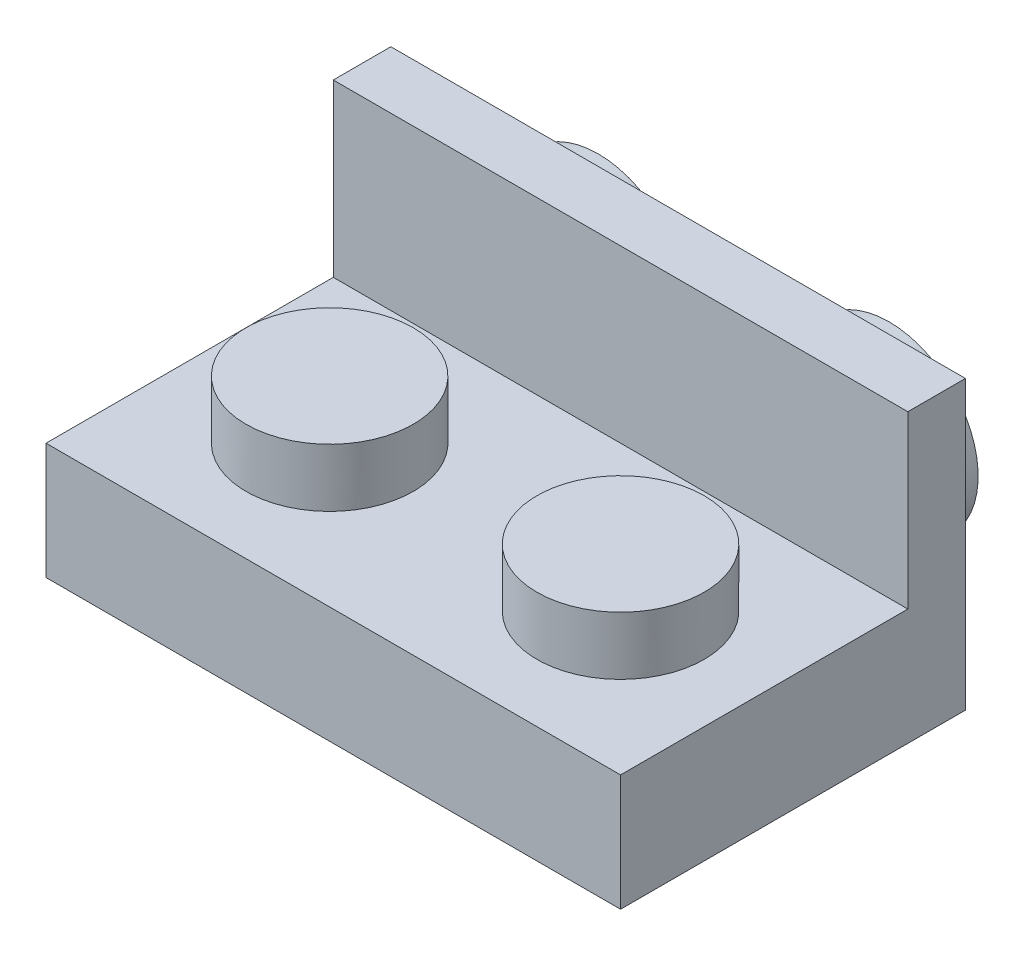
ISO-10303-21;
HEADER;
FILE_DESCRIPTION(('STEP AP214'),'2;1');
FILE_NAME('part.step','',(''),(''),'','','');
FILE_SCHEMA(('AUTOMOTIVE_DESIGN { 1 0 10303 214 1 1 1 1 }'));
ENDSEC;
DATA;
#1=APPLICATION_CONTEXT('core data for automotive mechanical design processes');
#2=APPLICATION_PROTOCOL_DEFINITION('international standard','automotive_design',2000,#1);
#3=PRODUCT_CONTEXT('',#1,'mechanical');
#4=PRODUCT('Part','Part','',(#3));
#5=PRODUCT_RELATED_PRODUCT_CATEGORY('part','',(#4));
#6=PRODUCT_DEFINITION_FORMATION('','',#4);
#7=PRODUCT_DEFINITION_CONTEXT('part definition',#1,'design');
#8=PRODUCT_DEFINITION('design','',#6,#7);
#9=PRODUCT_DEFINITION_SHAPE('','',#8);
#10=(LENGTH_UNIT() NAMED_UNIT(*) SI_UNIT(.MILLI.,.METRE.));
#11=(NAMED_UNIT(*) PLANE_ANGLE_UNIT() SI_UNIT($,.RADIAN.));
#12=(NAMED_UNIT(*) SI_UNIT($,.STERADIAN.) SOLID_ANGLE_UNIT());
#13=UNCERTAINTY_MEASURE_WITH_UNIT(LENGTH_MEASURE(1.E-05),#10,'distance_accuracy_value','');
#14=(GEOMETRIC_REPRESENTATION_CONTEXT(3) GLOBAL_UNCERTAINTY_ASSIGNED_CONTEXT((#13)) GLOBAL_UNIT_ASSIGNED_CONTEXT((#10,
#11,#12)) REPRESENTATION_CONTEXT('',''));
#15=CARTESIAN_POINT('',(0.,0.,0.));
#16=DIRECTION('',(0.,0.,1.));
#17=DIRECTION('',(1.,0.,0.));
#18=AXIS2_PLACEMENT_3D('',#15,#16,#17);
#19=CARTESIAN_POINT('',(0.681967213114738,2.,7.9));
#20=DIRECTION('',(0.,-1.,0.));
#21=DIRECTION('',(0.,0.,-1.));
#22=AXIS2_PLACEMENT_3D('',#19,#20,#21);
#23=PLANE('',#22);
#24=CARTESIAN_POINT('',(8.58196721311474,2.,4.));
#25=DIRECTION('',(0.,-1.,0.));
#26=DIRECTION('',(0.,0.,-1.));
#27=AXIS2_PLACEMENT_3D('',#24,#25,#26);
#28=CIRCLE('',#27,1.75);
#29=CARTESIAN_POINT('',(8.58196721311474,2.,2.25));
#30=VERTEX_POINT('',#29);
#31=EDGE_CURVE('E326',#30,#30,#28,.F.);
#32=ORIENTED_EDGE('',*,*,#31,.T.);
#33=EDGE_LOOP('',(#32));
#34=FACE_BOUND('',#33,.T.);
#35=CARTESIAN_POINT('',(12.5819672131147,2.,4.));
#36=DIRECTION('',(0.,-1.,0.));
#37=DIRECTION('',(0.,0.,-1.));
#38=AXIS2_PLACEMENT_3D('',#35,#36,#37);
#39=CIRCLE('',#38,1.1);
#40=CARTESIAN_POINT('',(12.5819672131147,2.,2.9));
#41=VERTEX_POINT('',#40);
#42=EDGE_CURVE('E335',#41,#41,#39,.F.);
#43=ORIENTED_EDGE('',*,*,#42,.T.);
#44=EDGE_LOOP('',(#43));
#45=FACE_BOUND('',#44,.T.);
#46=CARTESIAN_POINT('',(4.58196721311474,2.,4.));
#47=DIRECTION('',(0.,-1.,0.));
#48=DIRECTION('',(0.,0.,-1.));
#49=AXIS2_PLACEMENT_3D('',#46,#47,#48);
#50=CIRCLE('',#49,1.1);
#51=CARTESIAN_POINT('',(4.58196721311474,2.,2.9));
#52=VERTEX_POINT('',#51);
#53=EDGE_CURVE('E338',#52,#52,#50,.F.);
#54=ORIENTED_EDGE('',*,*,#53,.T.);
#55=EDGE_LOOP('',(#54));
#56=FACE_BOUND('',#55,.T.);
#57=DIRECTION('',(1.,0.,0.));
#58=VECTOR('',#57,1.);
#59=CARTESIAN_POINT('',(0.681967213114738,2.,1.11625417247108));
#60=LINE('',#59,#58);
#61=CARTESIAN_POINT('',(12.083755575767,2.,1.11625417247108));
#62=VERTEX_POINT('',#61);
#63=CARTESIAN_POINT('',(13.0805836740926,2.,1.11625417247108));
#64=VERTEX_POINT('',#63);
#65=EDGE_CURVE('E57',#62,#64,#60,.T.);
#66=ORIENTED_EDGE('',*,*,#65,.T.);
#67=DIRECTION('',(0.,0.,-1.));
#68=VECTOR('',#67,1.);
#69=CARTESIAN_POINT('',(13.0805836740926,2.,7.9));
#70=LINE('',#69,#68);
#71=CARTESIAN_POINT('',(13.0805836740926,2.,-0.383745827528921));
#72=VERTEX_POINT('',#71);
#73=EDGE_CURVE('E280',#64,#72,#70,.T.);
#74=ORIENTED_EDGE('',*,*,#73,.T.);
#75=DIRECTION('',(1.,0.,0.));
#76=VECTOR('',#75,1.);
#77=CARTESIAN_POINT('',(0.,2.,-0.383745827528922));
#78=LINE('',#77,#76);
#79=CARTESIAN_POINT('',(15.2819672131147,2.,-0.38374582752892));
#80=VERTEX_POINT('',#79);
#81=EDGE_CURVE('E197',#72,#80,#78,.T.);
#82=ORIENTED_EDGE('',*,*,#81,.T.);
#83=DIRECTION('',(0.,0.,-1.));
#84=VECTOR('',#83,1.);
#85=CARTESIAN_POINT('',(15.2819672131147,2.,7.9));
#86=LINE('',#85,#84);
#87=CARTESIAN_POINT('',(15.2819672131147,2.,6.7));
#88=VERTEX_POINT('',#87);
#89=EDGE_CURVE('E344',#88,#80,#86,.T.);
#90=ORIENTED_EDGE('',*,*,#89,.F.);
#91=DIRECTION('',(-1.,0.,0.));
#92=VECTOR('',#91,1.);
#93=CARTESIAN_POINT('',(0.,2.,6.7));
#94=LINE('',#93,#92);
#95=CARTESIAN_POINT('',(1.88196721311474,2.,6.7));
#96=VERTEX_POINT('',#95);
#97=EDGE_CURVE('E345',#88,#96,#94,.T.);
#98=ORIENTED_EDGE('',*,*,#97,.T.);
#99=DIRECTION('',(0.,0.,-1.));
#100=VECTOR('',#99,1.);
#101=CARTESIAN_POINT('',(1.88196721311474,2.,7.9));
#102=LINE('',#101,#100);
#103=CARTESIAN_POINT('',(1.88196721311474,2.,-0.383745827528922));
#104=VERTEX_POINT('',#103);
#105=EDGE_CURVE('E342',#96,#104,#102,.T.);
#106=ORIENTED_EDGE('',*,*,#105,.T.);
#107=CARTESIAN_POINT('',(4.08335075213692,2.,-0.383745827528922));
#108=VERTEX_POINT('',#107);
#109=EDGE_CURVE('E283',#104,#108,#78,.T.);
#110=ORIENTED_EDGE('',*,*,#109,.T.);
#111=DIRECTION('',(0.,0.,1.));
#112=VECTOR('',#111,1.);
#113=CARTESIAN_POINT('',(4.08335075213692,2.,7.9));
#114=LINE('',#113,#112);
#115=CARTESIAN_POINT('',(4.08335075213692,2.,1.11625417247108));
#116=VERTEX_POINT('',#115);
#117=EDGE_CURVE('E270',#108,#116,#114,.T.);
#118=ORIENTED_EDGE('',*,*,#117,.T.);
#119=DIRECTION('',(1.,0.,0.));
#120=VECTOR('',#119,1.);
#121=CARTESIAN_POINT('',(0.681967213114738,2.,1.11625417247108));
#122=LINE('',#121,#120);
#123=CARTESIAN_POINT('',(5.08017885046247,2.,1.11625417247108));
#124=VERTEX_POINT('',#123);
#125=EDGE_CURVE('E393',#116,#124,#122,.T.);
#126=ORIENTED_EDGE('',*,*,#125,.T.);
#127=DIRECTION('',(0.,0.,-1.));
#128=VECTOR('',#127,1.);
#129=CARTESIAN_POINT('',(5.08017885046247,2.,7.9));
#130=LINE('',#129,#128);
#131=CARTESIAN_POINT('',(5.08017885046247,2.,-0.383745827528922));
#132=VERTEX_POINT('',#131);
#133=EDGE_CURVE('E199',#124,#132,#130,.T.);
#134=ORIENTED_EDGE('',*,*,#133,.T.);
#135=CARTESIAN_POINT('',(8.07925649111435,2.,-0.383745827528921));
#136=VERTEX_POINT('',#135);
#137=EDGE_CURVE('E287',#132,#136,#78,.T.);
#138=ORIENTED_EDGE('',*,*,#137,.T.);
#139=DIRECTION('',(0.,0.,1.));
#140=VECTOR('',#139,1.);
#141=CARTESIAN_POINT('',(8.07925649111435,2.,7.9));
#142=LINE('',#141,#140);
#143=CARTESIAN_POINT('',(8.07925649111435,2.,1.11625417247108));
#144=VERTEX_POINT('',#143);
#145=EDGE_CURVE('E276',#136,#144,#142,.T.);
#146=ORIENTED_EDGE('',*,*,#145,.T.);
#147=DIRECTION('',(1.,0.,0.));
#148=VECTOR('',#147,1.);
#149=CARTESIAN_POINT('',(0.681967213114737,2.,1.11625417247108));
#150=LINE('',#149,#148);
#151=CARTESIAN_POINT('',(9.07608458943991,2.,1.11625417247108));
#152=VERTEX_POINT('',#151);
#153=EDGE_CURVE('E398',#144,#152,#150,.T.);
#154=ORIENTED_EDGE('',*,*,#153,.T.);
#155=DIRECTION('',(0.,0.,-1.));
#156=VECTOR('',#155,1.);
#157=CARTESIAN_POINT('',(9.07608458943991,2.,7.9));
#158=LINE('',#157,#156);
#159=CARTESIAN_POINT('',(9.07608458943991,2.,-0.383745827528922));
#160=VERTEX_POINT('',#159);
#161=EDGE_CURVE('E273',#152,#160,#158,.T.);
#162=ORIENTED_EDGE('',*,*,#161,.T.);
#163=CARTESIAN_POINT('',(12.083755575767,2.,-0.383745827528921));
#164=VERTEX_POINT('',#163);
#165=EDGE_CURVE('E547',#160,#164,#78,.T.);
#166=ORIENTED_EDGE('',*,*,#165,.T.);
#167=DIRECTION('',(0.,0.,1.));
#168=VECTOR('',#167,1.);
#169=CARTESIAN_POINT('',(12.083755575767,2.,7.90000000000001));
#170=LINE('',#169,#168);
#171=EDGE_CURVE('E62',#164,#62,#170,.T.);
#172=ORIENTED_EDGE('',*,*,#171,.T.);
#173=EDGE_LOOP('',(#66,#74,#82,#90,#98,#106,#110,#118,#126,#134,#138,#146,#154,#162,#166,#172));
#174=FACE_BOUND('',#173,.T.);
#175=ADVANCED_FACE('F41',(#34,#45,#56,#174),#23,.T.);
#176=CARTESIAN_POINT('',(0.,15.4931550495251,-0.383745827528922));
#177=DIRECTION('',(0.,0.,1.));
#178=DIRECTION('',(1.,0.,0.));
#179=AXIS2_PLACEMENT_3D('',#176,#177,#178);
#180=PLANE('',#179);
#181=ORIENTED_EDGE('',*,*,#81,.F.);
#182=DIRECTION('',(0.,1.,0.));
#183=VECTOR('',#182,1.);
#184=CARTESIAN_POINT('',(13.0805836740926,0.0500000000000006,-0.383745827528916));
#185=LINE('',#184,#183);
#186=CARTESIAN_POINT('',(13.0805836740926,0.0500000000000006,-0.383745827528916));
#187=VERTEX_POINT('',#186);
#188=EDGE_CURVE('E190',#187,#72,#185,.T.);
#189=ORIENTED_EDGE('',*,*,#188,.F.);
#190=DIRECTION('',(1.,0.,0.));
#191=VECTOR('',#190,1.);
#192=CARTESIAN_POINT('',(13.0805836740926,0.0500000000000006,-0.383745827528916));
#193=LINE('',#192,#191);
#194=CARTESIAN_POINT('',(12.083755575767,0.0499999999999997,-0.383745827528921));
#195=VERTEX_POINT('',#194);
#196=EDGE_CURVE('E194',#195,#187,#193,.T.);
#197=ORIENTED_EDGE('',*,*,#196,.F.);
#198=DIRECTION('',(0.,1.,0.));
#199=VECTOR('',#198,1.);
#200=CARTESIAN_POINT('',(12.083755575767,0.0500000000000006,-0.383745827528916));
#201=LINE('',#200,#199);
#202=EDGE_CURVE('E225',#195,#164,#201,.T.);
#203=ORIENTED_EDGE('',*,*,#202,.T.);
#204=ORIENTED_EDGE('',*,*,#165,.F.);
#205=DIRECTION('',(0.,1.,0.));
#206=VECTOR('',#205,1.);
#207=CARTESIAN_POINT('',(9.07608458943991,0.0500000000000006,-0.383745827528922));
#208=LINE('',#207,#206);
#209=CARTESIAN_POINT('',(9.07608458943991,0.0500000000000006,-0.383745827528922));
#210=VERTEX_POINT('',#209);
#211=EDGE_CURVE('E238',#210,#160,#208,.T.);
#212=ORIENTED_EDGE('',*,*,#211,.F.);
#213=DIRECTION('',(1.,0.,0.));
#214=VECTOR('',#213,1.);
#215=CARTESIAN_POINT('',(8.07925649111435,0.0500000000000006,-0.383745827528921));
#216=LINE('',#215,#214);
#217=CARTESIAN_POINT('',(8.07925649111435,0.0499999999999997,-0.383745827528921));
#218=VERTEX_POINT('',#217);
#219=EDGE_CURVE('E245',#218,#210,#216,.T.);
#220=ORIENTED_EDGE('',*,*,#219,.F.);
#221=DIRECTION('',(0.,1.,0.));
#222=VECTOR('',#221,1.);
#223=CARTESIAN_POINT('',(8.07925649111435,0.0500000000000006,-0.383745827528921));
#224=LINE('',#223,#222);
#225=EDGE_CURVE('E234',#218,#136,#224,.T.);
#226=ORIENTED_EDGE('',*,*,#225,.T.);
#227=ORIENTED_EDGE('',*,*,#137,.F.);
#228=DIRECTION('',(0.,1.,0.));
#229=VECTOR('',#228,1.);
#230=CARTESIAN_POINT('',(5.08017885046247,0.0500000000000001,-0.383745827528922));
#231=LINE('',#230,#229);
#232=CARTESIAN_POINT('',(5.08017885046247,0.0500000000000001,-0.383745827528922));
#233=VERTEX_POINT('',#232);
#234=EDGE_CURVE('E252',#233,#132,#231,.T.);
#235=ORIENTED_EDGE('',*,*,#234,.F.);
#236=DIRECTION('',(1.,0.,0.));
#237=VECTOR('',#236,1.);
#238=CARTESIAN_POINT('',(4.08335075213692,0.0500000000000001,-0.383745827528922));
#239=LINE('',#238,#237);
#240=CARTESIAN_POINT('',(4.08335075213692,0.0499999999999997,-0.383745827528922));
#241=VERTEX_POINT('',#240);
#242=EDGE_CURVE('E264',#241,#233,#239,.T.);
#243=ORIENTED_EDGE('',*,*,#242,.F.);
#244=DIRECTION('',(0.,1.,0.));
#245=VECTOR('',#244,1.);
#246=CARTESIAN_POINT('',(4.08335075213692,0.0500000000000001,-0.383745827528922));
#247=LINE('',#246,#245);
#248=EDGE_CURVE('E249',#241,#108,#247,.T.);
#249=ORIENTED_EDGE('',*,*,#248,.T.);
#250=ORIENTED_EDGE('',*,*,#109,.F.);
#251=DIRECTION('',(0.,-1.,0.));
#252=VECTOR('',#251,1.);
#253=CARTESIAN_POINT('',(1.88196721311474,15.4931550495251,-0.383745827528922));
#254=LINE('',#253,#252);
#255=CARTESIAN_POINT('',(1.88196721311474,0.,-0.383745827528922));
#256=VERTEX_POINT('',#255);
#257=EDGE_CURVE('E291',#104,#256,#254,.T.);
#258=ORIENTED_EDGE('',*,*,#257,.T.);
#259=DIRECTION('',(-1.,0.,0.));
#260=VECTOR('',#259,1.);
#261=CARTESIAN_POINT('',(0.,0.,-0.383745827528922));
#262=LINE('',#261,#260);
#263=CARTESIAN_POINT('',(15.2819672131147,0.,-0.38374582752892));
#264=VERTEX_POINT('',#263);
#265=EDGE_CURVE('E282',#264,#256,#262,.T.);
#266=ORIENTED_EDGE('',*,*,#265,.F.);
#267=DIRECTION('',(0.,-1.,0.));
#268=VECTOR('',#267,1.);
#269=CARTESIAN_POINT('',(15.2819672131147,15.4931550495251,-0.38374582752892));
#270=LINE('',#269,#268);
#271=EDGE_CURVE('E290',#80,#264,#270,.T.);
#272=ORIENTED_EDGE('',*,*,#271,.F.);
#273=EDGE_LOOP('',(#181,#189,#197,#203,#204,#212,#220,#226,#227,#235,#243,#249,#250,#258,#266,#272));
#274=FACE_BOUND('',#273,.T.);
#275=ADVANCED_FACE('F192',(#274),#180,.T.);
#276=CARTESIAN_POINT('',(0.681967213114738,0.,7.9));
#277=DIRECTION('',(0.,1.,0.));
#278=DIRECTION('',(0.,0.,1.));
#279=AXIS2_PLACEMENT_3D('',#276,#277,#278);
#280=PLANE('',#279);
#281=DIRECTION('',(0.,0.,-1.));
#282=VECTOR('',#281,1.);
#283=CARTESIAN_POINT('',(0.681967213114738,0.,7.9));
#284=LINE('',#283,#282);
#285=CARTESIAN_POINT('',(0.681967213114738,0.,7.9));
#286=VERTEX_POINT('',#285);
#287=CARTESIAN_POINT('',(0.68196721311474,0.,-1.58374582752892));
#288=VERTEX_POINT('',#287);
#289=EDGE_CURVE('E379',#286,#288,#284,.T.);
#290=ORIENTED_EDGE('',*,*,#289,.T.);
#291=DIRECTION('',(1.,0.,0.));
#292=VECTOR('',#291,1.);
#293=CARTESIAN_POINT('',(0.68196721311474,0.,-1.58374582752892));
#294=LINE('',#293,#292);
#295=CARTESIAN_POINT('',(16.4819672131147,0.,-1.58374582752892));
#296=VERTEX_POINT('',#295);
#297=EDGE_CURVE('E302',#288,#296,#294,.T.);
#298=ORIENTED_EDGE('',*,*,#297,.T.);
#299=DIRECTION('',(0.,0.,-1.));
#300=VECTOR('',#299,1.);
#301=CARTESIAN_POINT('',(16.4819672131147,0.,7.9));
#302=LINE('',#301,#300);
#303=CARTESIAN_POINT('',(16.4819672131147,0.,7.9));
#304=VERTEX_POINT('',#303);
#305=EDGE_CURVE('E377',#304,#296,#302,.T.);
#306=ORIENTED_EDGE('',*,*,#305,.F.);
#307=DIRECTION('',(1.,0.,0.));
#308=VECTOR('',#307,1.);
#309=CARTESIAN_POINT('',(0.681967213114738,0.,7.9));
#310=LINE('',#309,#308);
#311=EDGE_CURVE('E366',#286,#304,#310,.T.);
#312=ORIENTED_EDGE('',*,*,#311,.F.);
#313=EDGE_LOOP('',(#290,#298,#306,#312));
#314=FACE_BOUND('',#313,.T.);
#315=DIRECTION('',(0.,0.,-1.));
#316=VECTOR('',#315,1.);
#317=CARTESIAN_POINT('',(15.2819672131147,0.,7.9));
#318=LINE('',#317,#316);
#319=CARTESIAN_POINT('',(15.2819672131147,0.,6.7));
#320=VERTEX_POINT('',#319);
#321=EDGE_CURVE('E350',#320,#264,#318,.T.);
#322=ORIENTED_EDGE('',*,*,#321,.T.);
#323=ORIENTED_EDGE('',*,*,#265,.T.);
#324=DIRECTION('',(0.,0.,-1.));
#325=VECTOR('',#324,1.);
#326=CARTESIAN_POINT('',(1.88196721311474,0.,7.9));
#327=LINE('',#326,#325);
#328=CARTESIAN_POINT('',(1.88196721311474,0.,6.7));
#329=VERTEX_POINT('',#328);
#330=EDGE_CURVE('E341',#329,#256,#327,.T.);
#331=ORIENTED_EDGE('',*,*,#330,.F.);
#332=DIRECTION('',(1.,0.,0.));
#333=VECTOR('',#332,1.);
#334=CARTESIAN_POINT('',(0.,0.,6.7));
#335=LINE('',#334,#333);
#336=EDGE_CURVE('E353',#329,#320,#335,.T.);
#337=ORIENTED_EDGE('',*,*,#336,.T.);
#338=EDGE_LOOP('',(#322,#323,#331,#337));
#339=FACE_BOUND('',#338,.T.);
#340=ADVANCED_FACE('F449',(#314,#339),#280,.F.);
#341=CARTESIAN_POINT('',(16.4819672131147,0.,7.9));
#342=DIRECTION('',(-1.,0.,0.));
#343=DIRECTION('',(0.,0.,1.));
#344=AXIS2_PLACEMENT_3D('',#341,#342,#343);
#345=PLANE('',#344);
#346=ORIENTED_EDGE('',*,*,#305,.T.);
#347=DIRECTION('',(0.,1.,0.));
#348=VECTOR('',#347,1.);
#349=CARTESIAN_POINT('',(16.4819672131147,7.9,-1.58374582752892));
#350=LINE('',#349,#348);
#351=CARTESIAN_POINT('',(16.4819672131147,7.9,-1.58374582752892));
#352=VERTEX_POINT('',#351);
#353=EDGE_CURVE('E299',#296,#352,#350,.T.);
#354=ORIENTED_EDGE('',*,*,#353,.T.);
#355=DIRECTION('',(0.,0.,1.));
#356=VECTOR('',#355,1.);
#357=CARTESIAN_POINT('',(16.4819672131147,7.9,-1.58374582752892));
#358=LINE('',#357,#356);
#359=CARTESIAN_POINT('',(16.4819672131147,7.9,0.));
#360=VERTEX_POINT('',#359);
#361=EDGE_CURVE('E305',#352,#360,#358,.T.);
#362=ORIENTED_EDGE('',*,*,#361,.T.);
#363=DIRECTION('',(0.,-1.,0.));
#364=VECTOR('',#363,1.);
#365=CARTESIAN_POINT('',(16.4819672131147,0.,0.));
#366=LINE('',#365,#364);
#367=CARTESIAN_POINT('',(16.4819672131147,3.2,0.));
#368=VERTEX_POINT('',#367);
#369=EDGE_CURVE('E315',#360,#368,#366,.T.);
#370=ORIENTED_EDGE('',*,*,#369,.T.);
#371=DIRECTION('',(0.,0.,-1.));
#372=VECTOR('',#371,1.);
#373=CARTESIAN_POINT('',(16.4819672131147,3.2,7.9));
#374=LINE('',#373,#372);
#375=CARTESIAN_POINT('',(16.4819672131147,3.2,7.9));
#376=VERTEX_POINT('',#375);
#377=EDGE_CURVE('E375',#376,#368,#374,.T.);
#378=ORIENTED_EDGE('',*,*,#377,.F.);
#379=DIRECTION('',(0.,1.,0.));
#380=VECTOR('',#379,1.);
#381=CARTESIAN_POINT('',(16.4819672131147,0.,7.9));
#382=LINE('',#381,#380);
#383=EDGE_CURVE('E368',#304,#376,#382,.T.);
#384=ORIENTED_EDGE('',*,*,#383,.F.);
#385=EDGE_LOOP('',(#346,#354,#362,#370,#378,#384));
#386=FACE_BOUND('',#385,.T.);
#387=ADVANCED_FACE('F517',(#386),#345,.F.);
#388=CARTESIAN_POINT('',(0.681967213114738,3.2,7.9));
#389=DIRECTION('',(0.,-1.,0.));
#390=DIRECTION('',(0.,0.,-1.));
#391=AXIS2_PLACEMENT_3D('',#388,#389,#390);
#392=PLANE('',#391);
#393=CARTESIAN_POINT('',(12.5819672131147,3.2,4.));
#394=DIRECTION('',(0.,-1.,0.));
#395=DIRECTION('',(0.,0.,-1.));
#396=AXIS2_PLACEMENT_3D('',#393,#394,#395);
#397=CIRCLE('',#396,2.3);
#398=CARTESIAN_POINT('',(12.5819672131147,3.2,1.7));
#399=VERTEX_POINT('',#398);
#400=EDGE_CURVE('E384',#399,#399,#397,.F.);
#401=ORIENTED_EDGE('',*,*,#400,.F.);
#402=EDGE_LOOP('',(#401));
#403=FACE_BOUND('',#402,.T.);
#404=CARTESIAN_POINT('',(4.58196721311474,3.2,4.));
#405=DIRECTION('',(0.,-1.,0.));
#406=DIRECTION('',(0.,0.,-1.));
#407=AXIS2_PLACEMENT_3D('',#404,#405,#406);
#408=CIRCLE('',#407,2.3);
#409=CARTESIAN_POINT('',(4.58196721311474,3.2,1.7));
#410=VERTEX_POINT('',#409);
#411=EDGE_CURVE('E381',#410,#410,#408,.F.);
#412=ORIENTED_EDGE('',*,*,#411,.F.);
#413=EDGE_LOOP('',(#412));
#414=FACE_BOUND('',#413,.T.);
#415=DIRECTION('',(1.,0.,0.));
#416=VECTOR('',#415,1.);
#417=CARTESIAN_POINT('',(0.681967213114738,3.2,0.));
#418=LINE('',#417,#416);
#419=CARTESIAN_POINT('',(0.681967213114738,3.2,0.));
#420=VERTEX_POINT('',#419);
#421=EDGE_CURVE('E327',#420,#368,#418,.T.);
#422=ORIENTED_EDGE('',*,*,#421,.F.);
#423=DIRECTION('',(0.,0.,-1.));
#424=VECTOR('',#423,1.);
#425=CARTESIAN_POINT('',(0.681967213114738,3.2,7.9));
#426=LINE('',#425,#424);
#427=CARTESIAN_POINT('',(0.681967213114738,3.2,7.9));
#428=VERTEX_POINT('',#427);
#429=EDGE_CURVE('E372',#428,#420,#426,.T.);
#430=ORIENTED_EDGE('',*,*,#429,.F.);
#431=DIRECTION('',(-1.,0.,0.));
#432=VECTOR('',#431,1.);
#433=CARTESIAN_POINT('',(0.681967213114738,3.2,7.9));
#434=LINE('',#433,#432);
#435=EDGE_CURVE('E370',#376,#428,#434,.T.);
#436=ORIENTED_EDGE('',*,*,#435,.F.);
#437=ORIENTED_EDGE('',*,*,#377,.T.);
#438=EDGE_LOOP('',(#422,#430,#436,#437));
#439=FACE_BOUND('',#438,.T.);
#440=ADVANCED_FACE('F509',(#403,#414,#439),#392,.F.);
#441=CARTESIAN_POINT('',(15.2819672131147,0.,7.9));
#442=DIRECTION('',(-1.,0.,0.));
#443=DIRECTION('',(0.,0.,1.));
#444=AXIS2_PLACEMENT_3D('',#441,#442,#443);
#445=PLANE('',#444);
#446=ORIENTED_EDGE('',*,*,#89,.T.);
#447=ORIENTED_EDGE('',*,*,#271,.T.);
#448=ORIENTED_EDGE('',*,*,#321,.F.);
#449=DIRECTION('',(0.,1.,0.));
#450=VECTOR('',#449,1.);
#451=CARTESIAN_POINT('',(15.2819672131147,0.,6.7));
#452=LINE('',#451,#450);
#453=EDGE_CURVE('E347',#320,#88,#452,.T.);
#454=ORIENTED_EDGE('',*,*,#453,.T.);
#455=EDGE_LOOP('',(#446,#447,#448,#454));
#456=FACE_BOUND('',#455,.T.);
#457=ADVANCED_FACE('F507',(#456),#445,.T.);
#458=CARTESIAN_POINT('',(12.5819672131147,4.8,4.));
#459=DIRECTION('',(0.,1.,0.));
#460=DIRECTION('',(0.,0.,1.));
#461=AXIS2_PLACEMENT_3D('',#458,#459,#460);
#462=PLANE('',#461);
#463=CARTESIAN_POINT('',(12.5819672131147,4.8,4.));
#464=DIRECTION('',(0.,1.,0.));
#465=DIRECTION('',(0.,0.,1.));
#466=AXIS2_PLACEMENT_3D('',#463,#464,#465);
#467=CIRCLE('',#466,2.3);
#468=CARTESIAN_POINT('',(12.5819672131147,4.8,6.3));
#469=VERTEX_POINT('',#468);
#470=EDGE_CURVE('E387',#469,#469,#467,.T.);
#471=ORIENTED_EDGE('',*,*,#470,.T.);
#472=EDGE_LOOP('',(#471));
#473=FACE_BOUND('',#472,.T.);
#474=ADVANCED_FACE('F43',(#473),#462,.T.);
#475=CARTESIAN_POINT('',(12.5819672131147,4.8,4.));
#476=DIRECTION('',(0.,-1.,0.));
#477=DIRECTION('',(0.,0.,-1.));
#478=AXIS2_PLACEMENT_3D('',#475,#476,#477);
#479=CYLINDRICAL_SURFACE('',#478,2.3);
#480=ORIENTED_EDGE('',*,*,#470,.F.);
#481=EDGE_LOOP('',(#480));
#482=FACE_BOUND('',#481,.T.);
#483=ORIENTED_EDGE('',*,*,#400,.T.);
#484=EDGE_LOOP('',(#483));
#485=FACE_BOUND('',#484,.T.);
#486=ADVANCED_FACE('F514',(#482,#485),#479,.T.);
#487=CARTESIAN_POINT('',(0.681967213114738,0.,7.9));
#488=DIRECTION('',(1.,0.,0.));
#489=DIRECTION('',(0.,0.,-1.));
#490=AXIS2_PLACEMENT_3D('',#487,#488,#489);
#491=PLANE('',#490);
#492=ORIENTED_EDGE('',*,*,#429,.T.);
#493=DIRECTION('',(0.,-1.,0.));
#494=VECTOR('',#493,1.);
#495=CARTESIAN_POINT('',(0.68196721311474,0.,0.));
#496=LINE('',#495,#494);
#497=CARTESIAN_POINT('',(0.68196721311474,7.9,0.));
#498=VERTEX_POINT('',#497);
#499=EDGE_CURVE('E308',#498,#420,#496,.T.);
#500=ORIENTED_EDGE('',*,*,#499,.F.);
#501=DIRECTION('',(0.,0.,1.));
#502=VECTOR('',#501,1.);
#503=CARTESIAN_POINT('',(0.68196721311474,7.9,-1.58374582752892));
#504=LINE('',#503,#502);
#505=CARTESIAN_POINT('',(0.68196721311474,7.9,-1.58374582752892));
#506=VERTEX_POINT('',#505);
#507=EDGE_CURVE('E298',#506,#498,#504,.T.);
#508=ORIENTED_EDGE('',*,*,#507,.F.);
#509=DIRECTION('',(0.,1.,0.));
#510=VECTOR('',#509,1.);
#511=CARTESIAN_POINT('',(0.68196721311474,7.9,-1.58374582752892));
#512=LINE('',#511,#510);
#513=EDGE_CURVE('E286',#288,#506,#512,.T.);
#514=ORIENTED_EDGE('',*,*,#513,.F.);
#515=ORIENTED_EDGE('',*,*,#289,.F.);
#516=DIRECTION('',(0.,-1.,0.));
#517=VECTOR('',#516,1.);
#518=CARTESIAN_POINT('',(0.681967213114738,0.,7.9));
#519=LINE('',#518,#517);
#520=EDGE_CURVE('E363',#428,#286,#519,.T.);
#521=ORIENTED_EDGE('',*,*,#520,.F.);
#522=EDGE_LOOP('',(#492,#500,#508,#514,#515,#521));
#523=FACE_BOUND('',#522,.T.);
#524=ADVANCED_FACE('F641',(#523),#491,.F.);
#525=CARTESIAN_POINT('',(0.,0.,7.9));
#526=DIRECTION('',(0.,0.,-1.));
#527=DIRECTION('',(-1.,0.,0.));
#528=AXIS2_PLACEMENT_3D('',#525,#526,#527);
#529=PLANE('',#528);
#530=ORIENTED_EDGE('',*,*,#520,.T.);
#531=ORIENTED_EDGE('',*,*,#311,.T.);
#532=ORIENTED_EDGE('',*,*,#383,.T.);
#533=ORIENTED_EDGE('',*,*,#435,.T.);
#534=EDGE_LOOP('',(#530,#531,#532,#533));
#535=FACE_BOUND('',#534,.T.);
#536=ADVANCED_FACE('F644',(#535),#529,.F.);
#537=CARTESIAN_POINT('',(4.58196721311474,4.8,4.));
#538=DIRECTION('',(0.,-1.,0.));
#539=DIRECTION('',(0.,0.,-1.));
#540=AXIS2_PLACEMENT_3D('',#537,#538,#539);
#541=CYLINDRICAL_SURFACE('',#540,2.3);
#542=CARTESIAN_POINT('',(4.58196721311474,4.8,4.));
#543=DIRECTION('',(0.,1.,0.));
#544=DIRECTION('',(0.,0.,1.));
#545=AXIS2_PLACEMENT_3D('',#542,#543,#544);
#546=CIRCLE('',#545,2.3);
#547=CARTESIAN_POINT('',(4.58196721311474,4.8,6.3));
#548=VERTEX_POINT('',#547);
#549=EDGE_CURVE('E334',#548,#548,#546,.T.);
#550=ORIENTED_EDGE('',*,*,#549,.F.);
#551=EDGE_LOOP('',(#550));
#552=FACE_BOUND('',#551,.T.);
#553=ORIENTED_EDGE('',*,*,#411,.T.);
#554=EDGE_LOOP('',(#553));
#555=FACE_BOUND('',#554,.T.);
#556=ADVANCED_FACE('F665',(#552,#555),#541,.T.);
#557=CARTESIAN_POINT('',(4.58196721311474,4.8,4.));
#558=DIRECTION('',(0.,1.,0.));
#559=DIRECTION('',(0.,0.,1.));
#560=AXIS2_PLACEMENT_3D('',#557,#558,#559);
#561=PLANE('',#560);
#562=ORIENTED_EDGE('',*,*,#549,.T.);
#563=EDGE_LOOP('',(#562));
#564=FACE_BOUND('',#563,.T.);
#565=ADVANCED_FACE('F499',(#564),#561,.T.);
#566=CARTESIAN_POINT('',(12.5819672131147,3.6,4.));
#567=DIRECTION('',(0.,1.,0.));
#568=DIRECTION('',(0.,0.,1.));
#569=AXIS2_PLACEMENT_3D('',#566,#567,#568);
#570=PLANE('',#569);
#571=CARTESIAN_POINT('',(12.5819672131147,3.6,4.));
#572=DIRECTION('',(0.,1.,0.));
#573=DIRECTION('',(0.,0.,1.));
#574=AXIS2_PLACEMENT_3D('',#571,#572,#573);
#575=CIRCLE('',#574,1.1);
#576=CARTESIAN_POINT('',(12.5819672131147,3.6,5.1));
#577=VERTEX_POINT('',#576);
#578=EDGE_CURVE('E331',#577,#577,#575,.T.);
#579=ORIENTED_EDGE('',*,*,#578,.F.);
#580=EDGE_LOOP('',(#579));
#581=FACE_BOUND('',#580,.T.);
#582=ADVANCED_FACE('F495',(#581),#570,.F.);
#583=CARTESIAN_POINT('',(12.5819672131147,4.8,4.));
#584=DIRECTION('',(0.,-1.,0.));
#585=DIRECTION('',(0.,0.,-1.));
#586=AXIS2_PLACEMENT_3D('',#583,#584,#585);
#587=CYLINDRICAL_SURFACE('',#586,1.1);
#588=ORIENTED_EDGE('',*,*,#578,.T.);
#589=EDGE_LOOP('',(#588));
#590=FACE_BOUND('',#589,.T.);
#591=ORIENTED_EDGE('',*,*,#42,.F.);
#592=EDGE_LOOP('',(#591));
#593=FACE_BOUND('',#592,.T.);
#594=ADVANCED_FACE('F498',(#590,#593),#587,.F.);
#595=CARTESIAN_POINT('',(1.88196721311474,0.,7.9));
#596=DIRECTION('',(1.,0.,0.));
#597=DIRECTION('',(0.,0.,-1.));
#598=AXIS2_PLACEMENT_3D('',#595,#596,#597);
#599=PLANE('',#598);
#600=ORIENTED_EDGE('',*,*,#330,.T.);
#601=ORIENTED_EDGE('',*,*,#257,.F.);
#602=ORIENTED_EDGE('',*,*,#105,.F.);
#603=DIRECTION('',(0.,-1.,0.));
#604=VECTOR('',#603,1.);
#605=CARTESIAN_POINT('',(1.88196721311474,0.,6.7));
#606=LINE('',#605,#604);
#607=EDGE_CURVE('E351',#96,#329,#606,.T.);
#608=ORIENTED_EDGE('',*,*,#607,.T.);
#609=EDGE_LOOP('',(#600,#601,#602,#608));
#610=FACE_BOUND('',#609,.T.);
#611=ADVANCED_FACE('F503',(#610),#599,.T.);
#612=CARTESIAN_POINT('',(0.,0.,6.7));
#613=DIRECTION('',(0.,0.,-1.));
#614=DIRECTION('',(-1.,0.,0.));
#615=AXIS2_PLACEMENT_3D('',#612,#613,#614);
#616=PLANE('',#615);
#617=ORIENTED_EDGE('',*,*,#607,.F.);
#618=ORIENTED_EDGE('',*,*,#97,.F.);
#619=ORIENTED_EDGE('',*,*,#453,.F.);
#620=ORIENTED_EDGE('',*,*,#336,.F.);
#621=EDGE_LOOP('',(#617,#618,#619,#620));
#622=FACE_BOUND('',#621,.T.);
#623=ADVANCED_FACE('F505',(#622),#616,.T.);
#624=CARTESIAN_POINT('',(4.58196721311474,4.8,4.));
#625=DIRECTION('',(0.,-1.,0.));
#626=DIRECTION('',(0.,0.,-1.));
#627=AXIS2_PLACEMENT_3D('',#624,#625,#626);
#628=CYLINDRICAL_SURFACE('',#627,1.1);
#629=CARTESIAN_POINT('',(4.58196721311474,3.6,4.));
#630=DIRECTION('',(0.,1.,0.));
#631=DIRECTION('',(0.,0.,1.));
#632=AXIS2_PLACEMENT_3D('',#629,#630,#631);
#633=CIRCLE('',#632,1.1);
#634=CARTESIAN_POINT('',(4.58196721311474,3.6,5.1));
#635=VERTEX_POINT('',#634);
#636=EDGE_CURVE('E330',#635,#635,#633,.T.);
#637=ORIENTED_EDGE('',*,*,#636,.T.);
#638=EDGE_LOOP('',(#637));
#639=FACE_BOUND('',#638,.T.);
#640=ORIENTED_EDGE('',*,*,#53,.F.);
#641=EDGE_LOOP('',(#640));
#642=FACE_BOUND('',#641,.T.);
#643=ADVANCED_FACE('F679',(#639,#642),#628,.F.);
#644=CARTESIAN_POINT('',(4.58196721311474,3.6,4.));
#645=DIRECTION('',(0.,1.,0.));
#646=DIRECTION('',(0.,0.,1.));
#647=AXIS2_PLACEMENT_3D('',#644,#645,#646);
#648=PLANE('',#647);
#649=ORIENTED_EDGE('',*,*,#636,.F.);
#650=EDGE_LOOP('',(#649));
#651=FACE_BOUND('',#650,.T.);
#652=ADVANCED_FACE('F490',(#651),#648,.F.);
#653=CARTESIAN_POINT('',(8.58196721311474,0.200000000000001,4.));
#654=DIRECTION('',(0.,-1.,0.));
#655=DIRECTION('',(1.,0.,0.));
#656=AXIS2_PLACEMENT_3D('',#653,#654,#655);
#657=PLANE('',#656);
#658=CARTESIAN_POINT('',(8.58196721311474,0.200000000000001,4.));
#659=DIRECTION('',(0.,-1.,0.));
#660=DIRECTION('',(1.,0.,0.));
#661=AXIS2_PLACEMENT_3D('',#658,#659,#660);
#662=CIRCLE('',#661,1.75);
#663=CARTESIAN_POINT('',(10.3319672131147,0.200000000000001,4.));
#664=VERTEX_POINT('',#663);
#665=EDGE_CURVE('E323',#664,#664,#662,.T.);
#666=ORIENTED_EDGE('',*,*,#665,.T.);
#667=EDGE_LOOP('',(#666));
#668=FACE_BOUND('',#667,.T.);
#669=CARTESIAN_POINT('',(8.58196721311474,0.200000000000001,4.));
#670=DIRECTION('',(0.,-1.,0.));
#671=DIRECTION('',(1.,0.,0.));
#672=AXIS2_PLACEMENT_3D('',#669,#670,#671);
#673=CIRCLE('',#672,0.75);
#674=CARTESIAN_POINT('',(9.33196721311474,0.200000000000001,4.));
#675=VERTEX_POINT('',#674);
#676=EDGE_CURVE('E320',#675,#675,#673,.T.);
#677=ORIENTED_EDGE('',*,*,#676,.F.);
#678=EDGE_LOOP('',(#677));
#679=FACE_BOUND('',#678,.T.);
#680=ADVANCED_FACE('F487',(#668,#679),#657,.T.);
#681=CARTESIAN_POINT('',(8.58196721311474,0.200000000000001,4.));
#682=DIRECTION('',(0.,1.,0.));
#683=DIRECTION('',(-1.,0.,0.));
#684=AXIS2_PLACEMENT_3D('',#681,#682,#683);
#685=CYLINDRICAL_SURFACE('',#684,1.75);
#686=ORIENTED_EDGE('',*,*,#31,.F.);
#687=EDGE_LOOP('',(#686));
#688=FACE_BOUND('',#687,.T.);
#689=ORIENTED_EDGE('',*,*,#665,.F.);
#690=EDGE_LOOP('',(#689));
#691=FACE_BOUND('',#690,.T.);
#692=ADVANCED_FACE('F469',(#688,#691),#685,.T.);
#693=CARTESIAN_POINT('',(8.58196721311474,0.200000000000001,4.));
#694=DIRECTION('',(0.,1.,0.));
#695=DIRECTION('',(-1.,0.,0.));
#696=AXIS2_PLACEMENT_3D('',#693,#694,#695);
#697=CYLINDRICAL_SURFACE('',#696,0.75);
#698=CARTESIAN_POINT('',(8.58196721311474,2.,4.));
#699=DIRECTION('',(0.,-1.,0.));
#700=DIRECTION('',(0.,0.,-1.));
#701=AXIS2_PLACEMENT_3D('',#698,#699,#700);
#702=CIRCLE('',#701,0.75);
#703=CARTESIAN_POINT('',(8.58196721311474,2.,3.25));
#704=VERTEX_POINT('',#703);
#705=EDGE_CURVE('E390',#704,#704,#702,.F.);
#706=ORIENTED_EDGE('',*,*,#705,.T.);
#707=EDGE_LOOP('',(#706));
#708=FACE_BOUND('',#707,.T.);
#709=ORIENTED_EDGE('',*,*,#676,.T.);
#710=EDGE_LOOP('',(#709));
#711=FACE_BOUND('',#710,.T.);
#712=ADVANCED_FACE('F456',(#708,#711),#697,.F.);
#713=ORIENTED_EDGE('',*,*,#705,.F.);
#714=EDGE_LOOP('',(#713));
#715=FACE_BOUND('',#714,.T.);
#716=ADVANCED_FACE('F443',(#715),#23,.T.);
#717=CARTESIAN_POINT('',(0.68196721311474,7.9,-1.58374582752892));
#718=DIRECTION('',(0.,0.,-1.));
#719=DIRECTION('',(0.,1.,0.));
#720=AXIS2_PLACEMENT_3D('',#717,#718,#719);
#721=PLANE('',#720);
#722=CARTESIAN_POINT('',(12.5819672131147,3.95,-1.58374582752892));
#723=DIRECTION('',(0.,0.,-1.));
#724=DIRECTION('',(0.,1.,0.));
#725=AXIS2_PLACEMENT_3D('',#722,#723,#724);
#726=CIRCLE('',#725,2.45);
#727=CARTESIAN_POINT('',(12.5819672131147,6.4,-1.58374582752892));
#728=VERTEX_POINT('',#727);
#729=EDGE_CURVE('E45',#728,#728,#726,.F.);
#730=ORIENTED_EDGE('',*,*,#729,.T.);
#731=EDGE_LOOP('',(#730));
#732=FACE_BOUND('',#731,.T.);
#733=CARTESIAN_POINT('',(4.58196721311474,3.95,-1.58374582752892));
#734=DIRECTION('',(0.,0.,-1.));
#735=DIRECTION('',(0.,1.,0.));
#736=AXIS2_PLACEMENT_3D('',#733,#734,#735);
#737=CIRCLE('',#736,2.45);
#738=CARTESIAN_POINT('',(4.58196721311474,6.4,-1.58374582752892));
#739=VERTEX_POINT('',#738);
#740=EDGE_CURVE('E404',#739,#739,#737,.F.);
#741=ORIENTED_EDGE('',*,*,#740,.T.);
#742=EDGE_LOOP('',(#741));
#743=FACE_BOUND('',#742,.T.);
#744=DIRECTION('',(1.,0.,0.));
#745=VECTOR('',#744,1.);
#746=CARTESIAN_POINT('',(0.68196721311474,7.9,-1.58374582752892));
#747=LINE('',#746,#745);
#748=EDGE_CURVE('E301',#506,#352,#747,.T.);
#749=ORIENTED_EDGE('',*,*,#748,.T.);
#750=ORIENTED_EDGE('',*,*,#353,.F.);
#751=ORIENTED_EDGE('',*,*,#297,.F.);
#752=ORIENTED_EDGE('',*,*,#513,.T.);
#753=EDGE_LOOP('',(#749,#750,#751,#752));
#754=FACE_BOUND('',#753,.T.);
#755=ADVANCED_FACE('F455',(#732,#743,#754),#721,.T.);
#756=CARTESIAN_POINT('',(0.68196721311474,7.9,-1.58374582752892));
#757=DIRECTION('',(0.,1.,0.));
#758=DIRECTION('',(0.,0.,1.));
#759=AXIS2_PLACEMENT_3D('',#756,#757,#758);
#760=PLANE('',#759);
#761=DIRECTION('',(1.,0.,0.));
#762=VECTOR('',#761,1.);
#763=CARTESIAN_POINT('',(0.68196721311474,7.9,0.));
#764=LINE('',#763,#762);
#765=EDGE_CURVE('E312',#498,#360,#764,.T.);
#766=ORIENTED_EDGE('',*,*,#765,.T.);
#767=ORIENTED_EDGE('',*,*,#361,.F.);
#768=ORIENTED_EDGE('',*,*,#748,.F.);
#769=ORIENTED_EDGE('',*,*,#507,.T.);
#770=EDGE_LOOP('',(#766,#767,#768,#769));
#771=FACE_BOUND('',#770,.T.);
#772=ADVANCED_FACE('F462',(#771),#760,.T.);
#773=CARTESIAN_POINT('',(0.68196721311474,0.,0.));
#774=DIRECTION('',(0.,0.,1.));
#775=DIRECTION('',(1.,0.,0.));
#776=AXIS2_PLACEMENT_3D('',#773,#774,#775);
#777=PLANE('',#776);
#778=ORIENTED_EDGE('',*,*,#499,.T.);
#779=ORIENTED_EDGE('',*,*,#421,.T.);
#780=ORIENTED_EDGE('',*,*,#369,.F.);
#781=ORIENTED_EDGE('',*,*,#765,.F.);
#782=EDGE_LOOP('',(#778,#779,#780,#781));
#783=FACE_BOUND('',#782,.T.);
#784=ADVANCED_FACE('F458',(#783),#777,.T.);
#785=CARTESIAN_POINT('',(4.08335075213692,0.0500000000000001,-0.383745827528922));
#786=DIRECTION('',(1.,0.,0.));
#787=DIRECTION('',(0.,1.,0.));
#788=AXIS2_PLACEMENT_3D('',#785,#786,#787);
#789=PLANE('',#788);
#790=ORIENTED_EDGE('',*,*,#117,.F.);
#791=ORIENTED_EDGE('',*,*,#248,.F.);
#792=DIRECTION('',(0.,0.,-1.));
#793=VECTOR('',#792,1.);
#794=CARTESIAN_POINT('',(4.08335075213692,0.0500000000000001,-0.383745827528922));
#795=LINE('',#794,#793);
#796=CARTESIAN_POINT('',(4.08335075213692,0.0500000000000001,1.11625417247108));
#797=VERTEX_POINT('',#796);
#798=EDGE_CURVE('E235',#797,#241,#795,.T.);
#799=ORIENTED_EDGE('',*,*,#798,.F.);
#800=DIRECTION('',(0.,1.,0.));
#801=VECTOR('',#800,1.);
#802=CARTESIAN_POINT('',(4.08335075213692,0.0500000000000001,1.11625417247108));
#803=LINE('',#802,#801);
#804=EDGE_CURVE('E257',#797,#116,#803,.T.);
#805=ORIENTED_EDGE('',*,*,#804,.T.);
#806=EDGE_LOOP('',(#790,#791,#799,#805));
#807=FACE_BOUND('',#806,.T.);
#808=ADVANCED_FACE('F467',(#807),#789,.F.);
#809=CARTESIAN_POINT('',(5.08017885046247,0.0500000000000001,1.11625417247108));
#810=DIRECTION('',(-1.,0.,0.));
#811=DIRECTION('',(0.,-1.,0.));
#812=AXIS2_PLACEMENT_3D('',#809,#810,#811);
#813=PLANE('',#812);
#814=ORIENTED_EDGE('',*,*,#133,.F.);
#815=DIRECTION('',(0.,1.,0.));
#816=VECTOR('',#815,1.);
#817=CARTESIAN_POINT('',(5.08017885046247,0.0500000000000001,1.11625417247108));
#818=LINE('',#817,#816);
#819=CARTESIAN_POINT('',(5.08017885046247,0.0500000000000001,1.11625417247108));
#820=VERTEX_POINT('',#819);
#821=EDGE_CURVE('E254',#820,#124,#818,.T.);
#822=ORIENTED_EDGE('',*,*,#821,.F.);
#823=DIRECTION('',(0.,0.,1.));
#824=VECTOR('',#823,1.);
#825=CARTESIAN_POINT('',(5.08017885046247,0.0500000000000001,1.11625417247108));
#826=LINE('',#825,#824);
#827=EDGE_CURVE('E262',#233,#820,#826,.T.);
#828=ORIENTED_EDGE('',*,*,#827,.F.);
#829=ORIENTED_EDGE('',*,*,#234,.T.);
#830=EDGE_LOOP('',(#814,#822,#828,#829));
#831=FACE_BOUND('',#830,.T.);
#832=ADVANCED_FACE('F481',(#831),#813,.F.);
#833=CARTESIAN_POINT('',(4.08335075213692,0.0500000000000001,1.11625417247108));
#834=DIRECTION('',(0.,0.,-1.));
#835=DIRECTION('',(-1.,0.,0.));
#836=AXIS2_PLACEMENT_3D('',#833,#834,#835);
#837=PLANE('',#836);
#838=ORIENTED_EDGE('',*,*,#125,.F.);
#839=ORIENTED_EDGE('',*,*,#804,.F.);
#840=DIRECTION('',(-1.,0.,0.));
#841=VECTOR('',#840,1.);
#842=CARTESIAN_POINT('',(4.08335075213692,0.0500000000000001,1.11625417247108));
#843=LINE('',#842,#841);
#844=EDGE_CURVE('E260',#820,#797,#843,.T.);
#845=ORIENTED_EDGE('',*,*,#844,.F.);
#846=ORIENTED_EDGE('',*,*,#821,.T.);
#847=EDGE_LOOP('',(#838,#839,#845,#846));
#848=FACE_BOUND('',#847,.T.);
#849=ADVANCED_FACE('F542',(#848),#837,.F.);
#850=CARTESIAN_POINT('',(0.,0.0500000000000001,0.));
#851=DIRECTION('',(0.,1.,0.));
#852=DIRECTION('',(0.,0.,1.));
#853=AXIS2_PLACEMENT_3D('',#850,#851,#852);
#854=PLANE('',#853);
#855=ORIENTED_EDGE('',*,*,#798,.T.);
#856=ORIENTED_EDGE('',*,*,#242,.T.);
#857=ORIENTED_EDGE('',*,*,#827,.T.);
#858=ORIENTED_EDGE('',*,*,#844,.T.);
#859=EDGE_LOOP('',(#855,#856,#857,#858));
#860=FACE_BOUND('',#859,.T.);
#861=ADVANCED_FACE('F536',(#860),#854,.F.);
#862=CARTESIAN_POINT('',(8.07925649111435,0.0500000000000006,1.11625417247108));
#863=DIRECTION('',(0.,0.,-1.));
#864=DIRECTION('',(-1.,0.,0.));
#865=AXIS2_PLACEMENT_3D('',#862,#863,#864);
#866=PLANE('',#865);
#867=ORIENTED_EDGE('',*,*,#153,.F.);
#868=DIRECTION('',(0.,1.,0.));
#869=VECTOR('',#868,1.);
#870=CARTESIAN_POINT('',(8.07925649111435,0.0500000000000006,1.11625417247108));
#871=LINE('',#870,#869);
#872=CARTESIAN_POINT('',(8.07925649111435,0.0500000000000006,1.11625417247108));
#873=VERTEX_POINT('',#872);
#874=EDGE_CURVE('E231',#873,#144,#871,.T.);
#875=ORIENTED_EDGE('',*,*,#874,.F.);
#876=DIRECTION('',(-1.,0.,0.));
#877=VECTOR('',#876,1.);
#878=CARTESIAN_POINT('',(8.07925649111435,0.0500000000000006,1.11625417247108));
#879=LINE('',#878,#877);
#880=CARTESIAN_POINT('',(9.07608458943991,0.0500000000000006,1.11625417247108));
#881=VERTEX_POINT('',#880);
#882=EDGE_CURVE('E214',#881,#873,#879,.T.);
#883=ORIENTED_EDGE('',*,*,#882,.F.);
#884=DIRECTION('',(0.,1.,0.));
#885=VECTOR('',#884,1.);
#886=CARTESIAN_POINT('',(9.07608458943991,0.0500000000000006,1.11625417247108));
#887=LINE('',#886,#885);
#888=EDGE_CURVE('E240',#881,#152,#887,.T.);
#889=ORIENTED_EDGE('',*,*,#888,.T.);
#890=EDGE_LOOP('',(#867,#875,#883,#889));
#891=FACE_BOUND('',#890,.T.);
#892=ADVANCED_FACE('F560',(#891),#866,.F.);
#893=CARTESIAN_POINT('',(8.07925649111435,0.0500000000000006,-0.383745827528921));
#894=DIRECTION('',(1.,0.,0.));
#895=DIRECTION('',(0.,1.,0.));
#896=AXIS2_PLACEMENT_3D('',#893,#894,#895);
#897=PLANE('',#896);
#898=ORIENTED_EDGE('',*,*,#145,.F.);
#899=ORIENTED_EDGE('',*,*,#225,.F.);
#900=DIRECTION('',(0.,0.,-1.));
#901=VECTOR('',#900,1.);
#902=CARTESIAN_POINT('',(8.07925649111435,0.0500000000000006,-0.383745827528921));
#903=LINE('',#902,#901);
#904=EDGE_CURVE('E217',#873,#218,#903,.T.);
#905=ORIENTED_EDGE('',*,*,#904,.F.);
#906=ORIENTED_EDGE('',*,*,#874,.T.);
#907=EDGE_LOOP('',(#898,#899,#905,#906));
#908=FACE_BOUND('',#907,.T.);
#909=ADVANCED_FACE('F563',(#908),#897,.F.);
#910=CARTESIAN_POINT('',(9.07608458943991,0.0500000000000006,1.11625417247108));
#911=DIRECTION('',(-1.,0.,0.));
#912=DIRECTION('',(0.,-1.,0.));
#913=AXIS2_PLACEMENT_3D('',#910,#911,#912);
#914=PLANE('',#913);
#915=ORIENTED_EDGE('',*,*,#161,.F.);
#916=ORIENTED_EDGE('',*,*,#888,.F.);
#917=DIRECTION('',(0.,0.,1.));
#918=VECTOR('',#917,1.);
#919=CARTESIAN_POINT('',(9.07608458943991,0.0500000000000006,1.11625417247108));
#920=LINE('',#919,#918);
#921=EDGE_CURVE('E243',#210,#881,#920,.T.);
#922=ORIENTED_EDGE('',*,*,#921,.F.);
#923=ORIENTED_EDGE('',*,*,#211,.T.);
#924=EDGE_LOOP('',(#915,#916,#922,#923));
#925=FACE_BOUND('',#924,.T.);
#926=ADVANCED_FACE('F556',(#925),#914,.F.);
#927=CARTESIAN_POINT('',(0.,0.0500000000000006,0.));
#928=DIRECTION('',(0.,1.,0.));
#929=DIRECTION('',(0.,0.,1.));
#930=AXIS2_PLACEMENT_3D('',#927,#928,#929);
#931=PLANE('',#930);
#932=ORIENTED_EDGE('',*,*,#882,.T.);
#933=ORIENTED_EDGE('',*,*,#904,.T.);
#934=ORIENTED_EDGE('',*,*,#219,.T.);
#935=ORIENTED_EDGE('',*,*,#921,.T.);
#936=EDGE_LOOP('',(#932,#933,#934,#935));
#937=FACE_BOUND('',#936,.T.);
#938=ADVANCED_FACE('F565',(#937),#931,.F.);
#939=CARTESIAN_POINT('',(13.0805836740926,0.0500000000000006,-0.383745827528916));
#940=DIRECTION('',(-1.,0.,0.));
#941=DIRECTION('',(0.,-1.,0.));
#942=AXIS2_PLACEMENT_3D('',#939,#940,#941);
#943=PLANE('',#942);
#944=ORIENTED_EDGE('',*,*,#73,.F.);
#945=DIRECTION('',(0.,1.,0.));
#946=VECTOR('',#945,1.);
#947=CARTESIAN_POINT('',(13.0805836740926,0.0500000000000006,1.11625417247108));
#948=LINE('',#947,#946);
#949=CARTESIAN_POINT('',(13.0805836740926,0.0500000000000006,1.11625417247108));
#950=VERTEX_POINT('',#949);
#951=EDGE_CURVE('E200',#950,#64,#948,.T.);
#952=ORIENTED_EDGE('',*,*,#951,.F.);
#953=DIRECTION('',(0.,0.,1.));
#954=VECTOR('',#953,1.);
#955=CARTESIAN_POINT('',(13.0805836740926,0.0500000000000006,-0.383745827528916));
#956=LINE('',#955,#954);
#957=EDGE_CURVE('E203',#187,#950,#956,.T.);
#958=ORIENTED_EDGE('',*,*,#957,.F.);
#959=ORIENTED_EDGE('',*,*,#188,.T.);
#960=EDGE_LOOP('',(#944,#952,#958,#959));
#961=FACE_BOUND('',#960,.T.);
#962=ADVANCED_FACE('F204',(#961),#943,.F.);
#963=CARTESIAN_POINT('',(13.0805836740926,0.0500000000000006,1.11625417247108));
#964=DIRECTION('',(0.,0.,-1.));
#965=DIRECTION('',(-1.,0.,0.));
#966=AXIS2_PLACEMENT_3D('',#963,#964,#965);
#967=PLANE('',#966);
#968=ORIENTED_EDGE('',*,*,#65,.F.);
#969=DIRECTION('',(0.,1.,0.));
#970=VECTOR('',#969,1.);
#971=CARTESIAN_POINT('',(12.083755575767,0.0500000000000006,1.11625417247108));
#972=LINE('',#971,#970);
#973=CARTESIAN_POINT('',(12.083755575767,0.0500000000000006,1.11625417247108));
#974=VERTEX_POINT('',#973);
#975=EDGE_CURVE('E227',#974,#62,#972,.T.);
#976=ORIENTED_EDGE('',*,*,#975,.F.);
#977=DIRECTION('',(-1.,0.,0.));
#978=VECTOR('',#977,1.);
#979=CARTESIAN_POINT('',(13.0805836740926,0.0500000000000006,1.11625417247108));
#980=LINE('',#979,#978);
#981=EDGE_CURVE('E208',#950,#974,#980,.T.);
#982=ORIENTED_EDGE('',*,*,#981,.F.);
#983=ORIENTED_EDGE('',*,*,#951,.T.);
#984=EDGE_LOOP('',(#968,#976,#982,#983));
#985=FACE_BOUND('',#984,.T.);
#986=ADVANCED_FACE('F550',(#985),#967,.F.);
#987=CARTESIAN_POINT('',(12.083755575767,0.0500000000000006,1.11625417247108));
#988=DIRECTION('',(1.,0.,0.));
#989=DIRECTION('',(0.,0.,-1.));
#990=AXIS2_PLACEMENT_3D('',#987,#988,#989);
#991=PLANE('',#990);
#992=ORIENTED_EDGE('',*,*,#171,.F.);
#993=ORIENTED_EDGE('',*,*,#202,.F.);
#994=DIRECTION('',(0.,0.,-1.));
#995=VECTOR('',#994,1.);
#996=CARTESIAN_POINT('',(12.083755575767,0.0500000000000006,1.11625417247108));
#997=LINE('',#996,#995);
#998=EDGE_CURVE('E212',#974,#195,#997,.T.);
#999=ORIENTED_EDGE('',*,*,#998,.F.);
#1000=ORIENTED_EDGE('',*,*,#975,.T.);
#1001=EDGE_LOOP('',(#992,#993,#999,#1000));
#1002=FACE_BOUND('',#1001,.T.);
#1003=ADVANCED_FACE('F437',(#1002),#991,.F.);
#1004=CARTESIAN_POINT('',(0.,0.0500000000000006,0.));
#1005=DIRECTION('',(0.,-1.,0.));
#1006=DIRECTION('',(0.,0.,-1.));
#1007=AXIS2_PLACEMENT_3D('',#1004,#1005,#1006);
#1008=PLANE('',#1007);
#1009=ORIENTED_EDGE('',*,*,#196,.T.);
#1010=ORIENTED_EDGE('',*,*,#957,.T.);
#1011=ORIENTED_EDGE('',*,*,#981,.T.);
#1012=ORIENTED_EDGE('',*,*,#998,.T.);
#1013=EDGE_LOOP('',(#1009,#1010,#1011,#1012));
#1014=FACE_BOUND('',#1013,.T.);
#1015=ADVANCED_FACE('F210',(#1014),#1008,.T.);
#1016=CARTESIAN_POINT('',(4.58196721311474,3.95,-3.38374582752892));
#1017=DIRECTION('',(0.,0.,1.));
#1018=DIRECTION('',(0.,-1.,0.));
#1019=AXIS2_PLACEMENT_3D('',#1016,#1017,#1018);
#1020=PLANE('',#1019);
#1021=CARTESIAN_POINT('',(4.58196721311474,3.95,-3.38374582752892));
#1022=DIRECTION('',(0.,0.,-1.));
#1023=DIRECTION('',(0.,-1.,0.));
#1024=AXIS2_PLACEMENT_3D('',#1021,#1022,#1023);
#1025=CIRCLE('',#1024,2.45);
#1026=CARTESIAN_POINT('',(4.58196721311474,1.5,-3.38374582752892));
#1027=VERTEX_POINT('',#1026);
#1028=EDGE_CURVE('E417',#1027,#1027,#1025,.T.);
#1029=ORIENTED_EDGE('',*,*,#1028,.T.);
#1030=EDGE_LOOP('',(#1029));
#1031=FACE_BOUND('',#1030,.T.);
#1032=CARTESIAN_POINT('',(4.58196721311474,3.95,-3.38374582752892));
#1033=DIRECTION('',(0.,0.,-1.));
#1034=DIRECTION('',(0.,-1.,0.));
#1035=AXIS2_PLACEMENT_3D('',#1032,#1033,#1034);
#1036=CIRCLE('',#1035,2.);
#1037=CARTESIAN_POINT('',(4.58196721311474,1.95,-3.38374582752892));
#1038=VERTEX_POINT('',#1037);
#1039=EDGE_CURVE('E220',#1038,#1038,#1036,.T.);
#1040=ORIENTED_EDGE('',*,*,#1039,.F.);
#1041=EDGE_LOOP('',(#1040));
#1042=FACE_BOUND('',#1041,.T.);
#1043=ADVANCED_FACE('F426',(#1031,#1042),#1020,.F.);
#1044=CARTESIAN_POINT('',(4.58196721311474,3.95,-3.38374582752892));
#1045=DIRECTION('',(0.,0.,1.));
#1046=DIRECTION('',(0.,-1.,0.));
#1047=AXIS2_PLACEMENT_3D('',#1044,#1045,#1046);
#1048=CYLINDRICAL_SURFACE('',#1047,2.45);
#1049=ORIENTED_EDGE('',*,*,#740,.F.);
#1050=EDGE_LOOP('',(#1049));
#1051=FACE_BOUND('',#1050,.T.);
#1052=ORIENTED_EDGE('',*,*,#1028,.F.);
#1053=EDGE_LOOP('',(#1052));
#1054=FACE_BOUND('',#1053,.T.);
#1055=ADVANCED_FACE('F428',(#1051,#1054),#1048,.T.);
#1056=CARTESIAN_POINT('',(4.58196721311474,3.95,-3.38374582752892));
#1057=DIRECTION('',(0.,0.,1.));
#1058=DIRECTION('',(0.,-1.,0.));
#1059=AXIS2_PLACEMENT_3D('',#1056,#1057,#1058);
#1060=CYLINDRICAL_SURFACE('',#1059,2.);
#1061=CARTESIAN_POINT('',(4.58196721311474,3.95,-1.58374582752892));
#1062=DIRECTION('',(0.,0.,-1.));
#1063=DIRECTION('',(0.,1.,0.));
#1064=AXIS2_PLACEMENT_3D('',#1061,#1062,#1063);
#1065=CIRCLE('',#1064,2.);
#1066=CARTESIAN_POINT('',(4.58196721311474,5.95,-1.58374582752892));
#1067=VERTEX_POINT('',#1066);
#1068=EDGE_CURVE('E50',#1067,#1067,#1065,.F.);
#1069=ORIENTED_EDGE('',*,*,#1068,.T.);
#1070=EDGE_LOOP('',(#1069));
#1071=FACE_BOUND('',#1070,.T.);
#1072=ORIENTED_EDGE('',*,*,#1039,.T.);
#1073=EDGE_LOOP('',(#1072));
#1074=FACE_BOUND('',#1073,.T.);
#1075=ADVANCED_FACE('F424',(#1071,#1074),#1060,.F.);
#1076=ORIENTED_EDGE('',*,*,#1068,.F.);
#1077=EDGE_LOOP('',(#1076));
#1078=FACE_BOUND('',#1077,.T.);
#1079=ADVANCED_FACE('F466',(#1078),#721,.T.);
#1080=CARTESIAN_POINT('',(12.5819672131147,3.95,-3.38374582752892));
#1081=DIRECTION('',(0.,0.,-1.));
#1082=DIRECTION('',(0.,1.,0.));
#1083=AXIS2_PLACEMENT_3D('',#1080,#1081,#1082);
#1084=PLANE('',#1083);
#1085=CARTESIAN_POINT('',(12.5819672131147,3.95,-3.38374582752892));
#1086=DIRECTION('',(0.,0.,-1.));
#1087=DIRECTION('',(0.,1.,0.));
#1088=AXIS2_PLACEMENT_3D('',#1085,#1086,#1087);
#1089=CIRCLE('',#1088,2.45);
#1090=CARTESIAN_POINT('',(12.5819672131147,6.4,-3.38374582752892));
#1091=VERTEX_POINT('',#1090);
#1092=EDGE_CURVE('E406',#1091,#1091,#1089,.T.);
#1093=ORIENTED_EDGE('',*,*,#1092,.T.);
#1094=EDGE_LOOP('',(#1093));
#1095=FACE_BOUND('',#1094,.T.);
#1096=CARTESIAN_POINT('',(12.5819672131147,3.95,-3.38374582752892));
#1097=DIRECTION('',(0.,0.,-1.));
#1098=DIRECTION('',(0.,1.,0.));
#1099=AXIS2_PLACEMENT_3D('',#1096,#1097,#1098);
#1100=CIRCLE('',#1099,2.);
#1101=CARTESIAN_POINT('',(12.5819672131147,5.95,-3.38374582752892));
#1102=VERTEX_POINT('',#1101);
#1103=EDGE_CURVE('E411',#1102,#1102,#1100,.T.);
#1104=ORIENTED_EDGE('',*,*,#1103,.F.);
#1105=EDGE_LOOP('',(#1104));
#1106=FACE_BOUND('',#1105,.T.);
#1107=ADVANCED_FACE('F597',(#1095,#1106),#1084,.T.);
#1108=CARTESIAN_POINT('',(12.5819672131147,3.95,-3.38374582752892));
#1109=DIRECTION('',(0.,0.,1.));
#1110=DIRECTION('',(0.,-1.,0.));
#1111=AXIS2_PLACEMENT_3D('',#1108,#1109,#1110);
#1112=CYLINDRICAL_SURFACE('',#1111,2.45);
#1113=ORIENTED_EDGE('',*,*,#729,.F.);
#1114=EDGE_LOOP('',(#1113));
#1115=FACE_BOUND('',#1114,.T.);
#1116=ORIENTED_EDGE('',*,*,#1092,.F.);
#1117=EDGE_LOOP('',(#1116));
#1118=FACE_BOUND('',#1117,.T.);
#1119=ADVANCED_FACE('F603',(#1115,#1118),#1112,.T.);
#1120=CARTESIAN_POINT('',(12.5819672131147,3.95,-3.38374582752892));
#1121=DIRECTION('',(0.,0.,1.));
#1122=DIRECTION('',(0.,-1.,0.));
#1123=AXIS2_PLACEMENT_3D('',#1120,#1121,#1122);
#1124=CYLINDRICAL_SURFACE('',#1123,2.);
#1125=CARTESIAN_POINT('',(12.5819672131147,3.95,-1.58374582752892));
#1126=DIRECTION('',(0.,0.,-1.));
#1127=DIRECTION('',(0.,1.,0.));
#1128=AXIS2_PLACEMENT_3D('',#1125,#1126,#1127);
#1129=CIRCLE('',#1128,2.);
#1130=CARTESIAN_POINT('',(12.5819672131147,5.95,-1.58374582752892));
#1131=VERTEX_POINT('',#1130);
#1132=EDGE_CURVE('E11',#1131,#1131,#1129,.F.);
#1133=ORIENTED_EDGE('',*,*,#1132,.T.);
#1134=EDGE_LOOP('',(#1133));
#1135=FACE_BOUND('',#1134,.T.);
#1136=ORIENTED_EDGE('',*,*,#1103,.T.);
#1137=EDGE_LOOP('',(#1136));
#1138=FACE_BOUND('',#1137,.T.);
#1139=ADVANCED_FACE('F606',(#1135,#1138),#1124,.F.);
#1140=ORIENTED_EDGE('',*,*,#1132,.F.);
#1141=EDGE_LOOP('',(#1140));
#1142=FACE_BOUND('',#1141,.T.);
#1143=ADVANCED_FACE('F465',(#1142),#721,.T.);
#1144=CLOSED_SHELL('',(#175,#275,#340,#387,#440,#457,#474,#486,#524,#536,#556,#565,#582,#594,
#611,#623,#643,#652,#680,#692,#712,#716,#755,#772,#784,#808,#832,#849,#861,#892,#909,#926,#938,
#962,#986,#1003,#1015,#1043,#1055,#1075,#1079,#1107,#1119,#1139,#1143));
#1145=MANIFOLD_SOLID_BREP('B2',#1144);
#1146=ADVANCED_BREP_SHAPE_REPRESENTATION('',(#18,#1145),#14);
#1147=SHAPE_DEFINITION_REPRESENTATION(#9,#1146);
ENDSEC;
END-ISO-10303-21;
